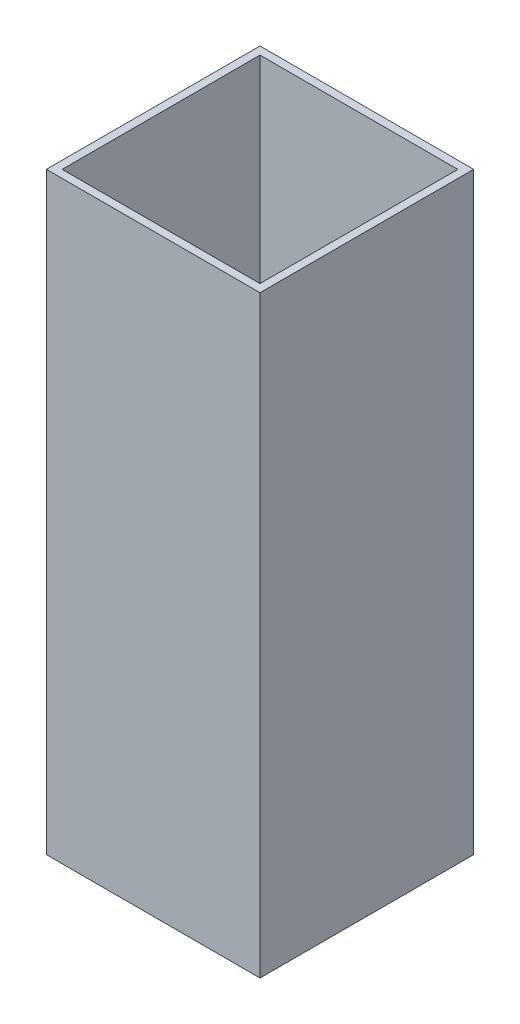
ISO-10303-21;
HEADER;
FILE_DESCRIPTION(('STEP AP214'),'2;1');
FILE_NAME('part.step','',(''),(''),'','','');
FILE_SCHEMA(('AUTOMOTIVE_DESIGN { 1 0 10303 214 1 1 1 1 }'));
ENDSEC;
DATA;
#1=APPLICATION_CONTEXT('core data for automotive mechanical design processes');
#2=APPLICATION_PROTOCOL_DEFINITION('international standard','automotive_design',2000,#1);
#3=PRODUCT_CONTEXT('',#1,'mechanical');
#4=PRODUCT('Part','Part','',(#3));
#5=PRODUCT_RELATED_PRODUCT_CATEGORY('part','',(#4));
#6=PRODUCT_DEFINITION_FORMATION('','',#4);
#7=PRODUCT_DEFINITION_CONTEXT('part definition',#1,'design');
#8=PRODUCT_DEFINITION('design','',#6,#7);
#9=PRODUCT_DEFINITION_SHAPE('','',#8);
#10=(LENGTH_UNIT() NAMED_UNIT(*) SI_UNIT(.MILLI.,.METRE.));
#11=(NAMED_UNIT(*) PLANE_ANGLE_UNIT() SI_UNIT($,.RADIAN.));
#12=(NAMED_UNIT(*) SI_UNIT($,.STERADIAN.) SOLID_ANGLE_UNIT());
#13=UNCERTAINTY_MEASURE_WITH_UNIT(LENGTH_MEASURE(1.E-05),#10,'distance_accuracy_value','');
#14=(GEOMETRIC_REPRESENTATION_CONTEXT(3) GLOBAL_UNCERTAINTY_ASSIGNED_CONTEXT((#13)) GLOBAL_UNIT_ASSIGNED_CONTEXT((#10,
#11,#12)) REPRESENTATION_CONTEXT('',''));
#15=CARTESIAN_POINT('',(0.,0.,0.));
#16=DIRECTION('',(0.,0.,1.));
#17=DIRECTION('',(1.,0.,0.));
#18=AXIS2_PLACEMENT_3D('',#15,#16,#17);
#19=CARTESIAN_POINT('',(-67.5,375.,67.5));
#20=DIRECTION('',(1.,0.,0.));
#21=DIRECTION('',(0.,0.,-1.));
#22=AXIS2_PLACEMENT_3D('',#19,#20,#21);
#23=PLANE('',#22);
#24=DIRECTION('',(0.,0.,1.));
#25=VECTOR('',#24,1.);
#26=CARTESIAN_POINT('',(-67.5,0.,67.5));
#27=LINE('',#26,#25);
#28=CARTESIAN_POINT('',(-67.5,0.,-67.5));
#29=VERTEX_POINT('',#28);
#30=CARTESIAN_POINT('',(-67.5,0.,67.5));
#31=VERTEX_POINT('',#30);
#32=EDGE_CURVE('E149',#29,#31,#27,.T.);
#33=ORIENTED_EDGE('',*,*,#32,.T.);
#34=DIRECTION('',(0.,-1.,0.));
#35=VECTOR('',#34,1.);
#36=CARTESIAN_POINT('',(-67.5,375.,67.5));
#37=LINE('',#36,#35);
#38=CARTESIAN_POINT('',(-67.5,375.,67.5));
#39=VERTEX_POINT('',#38);
#40=EDGE_CURVE('E11',#39,#31,#37,.T.);
#41=ORIENTED_EDGE('',*,*,#40,.F.);
#42=DIRECTION('',(0.,0.,1.));
#43=VECTOR('',#42,1.);
#44=CARTESIAN_POINT('',(-67.5,375.,67.5));
#45=LINE('',#44,#43);
#46=CARTESIAN_POINT('',(-67.5,375.,-67.5));
#47=VERTEX_POINT('',#46);
#48=EDGE_CURVE('E142',#47,#39,#45,.T.);
#49=ORIENTED_EDGE('',*,*,#48,.F.);
#50=DIRECTION('',(0.,-1.,0.));
#51=VECTOR('',#50,1.);
#52=CARTESIAN_POINT('',(-67.5,375.,-67.5));
#53=LINE('',#52,#51);
#54=EDGE_CURVE('E148',#47,#29,#53,.T.);
#55=ORIENTED_EDGE('',*,*,#54,.T.);
#56=EDGE_LOOP('',(#33,#41,#49,#55));
#57=FACE_BOUND('',#56,.T.);
#58=ADVANCED_FACE('F35',(#57),#23,.F.);
#59=CARTESIAN_POINT('',(67.5,375.,67.5));
#60=DIRECTION('',(0.,0.,-1.));
#61=DIRECTION('',(-1.,0.,0.));
#62=AXIS2_PLACEMENT_3D('',#59,#60,#61);
#63=PLANE('',#62);
#64=DIRECTION('',(1.,0.,0.));
#65=VECTOR('',#64,1.);
#66=CARTESIAN_POINT('',(67.5,0.,67.5));
#67=LINE('',#66,#65);
#68=CARTESIAN_POINT('',(67.5,0.,67.5));
#69=VERTEX_POINT('',#68);
#70=EDGE_CURVE('E152',#31,#69,#67,.T.);
#71=ORIENTED_EDGE('',*,*,#70,.T.);
#72=DIRECTION('',(0.,-1.,0.));
#73=VECTOR('',#72,1.);
#74=CARTESIAN_POINT('',(67.5,375.,67.5));
#75=LINE('',#74,#73);
#76=CARTESIAN_POINT('',(67.5,375.,67.5));
#77=VERTEX_POINT('',#76);
#78=EDGE_CURVE('E42',#77,#69,#75,.T.);
#79=ORIENTED_EDGE('',*,*,#78,.F.);
#80=DIRECTION('',(1.,0.,0.));
#81=VECTOR('',#80,1.);
#82=CARTESIAN_POINT('',(67.5,375.,67.5));
#83=LINE('',#82,#81);
#84=EDGE_CURVE('E86',#39,#77,#83,.T.);
#85=ORIENTED_EDGE('',*,*,#84,.F.);
#86=ORIENTED_EDGE('',*,*,#40,.T.);
#87=EDGE_LOOP('',(#71,#79,#85,#86));
#88=FACE_BOUND('',#87,.T.);
#89=ADVANCED_FACE('F181',(#88),#63,.F.);
#90=CARTESIAN_POINT('',(67.5,375.,67.5));
#91=DIRECTION('',(-1.,0.,0.));
#92=DIRECTION('',(0.,0.,1.));
#93=AXIS2_PLACEMENT_3D('',#90,#91,#92);
#94=PLANE('',#93);
#95=DIRECTION('',(0.,0.,-1.));
#96=VECTOR('',#95,1.);
#97=CARTESIAN_POINT('',(67.5,0.,67.5));
#98=LINE('',#97,#96);
#99=CARTESIAN_POINT('',(67.5,0.,-67.5));
#100=VERTEX_POINT('',#99);
#101=EDGE_CURVE('E154',#69,#100,#98,.T.);
#102=ORIENTED_EDGE('',*,*,#101,.T.);
#103=DIRECTION('',(0.,-1.,0.));
#104=VECTOR('',#103,1.);
#105=CARTESIAN_POINT('',(67.5,375.,-67.5));
#106=LINE('',#105,#104);
#107=CARTESIAN_POINT('',(67.5,375.,-67.5));
#108=VERTEX_POINT('',#107);
#109=EDGE_CURVE('E158',#108,#100,#106,.T.);
#110=ORIENTED_EDGE('',*,*,#109,.F.);
#111=DIRECTION('',(0.,0.,-1.));
#112=VECTOR('',#111,1.);
#113=CARTESIAN_POINT('',(67.5,375.,67.5));
#114=LINE('',#113,#112);
#115=EDGE_CURVE('E145',#77,#108,#114,.T.);
#116=ORIENTED_EDGE('',*,*,#115,.F.);
#117=ORIENTED_EDGE('',*,*,#78,.T.);
#118=EDGE_LOOP('',(#102,#110,#116,#117));
#119=FACE_BOUND('',#118,.T.);
#120=ADVANCED_FACE('F163',(#119),#94,.F.);
#121=CARTESIAN_POINT('',(67.5,375.,-67.5));
#122=DIRECTION('',(0.,0.,1.));
#123=DIRECTION('',(1.,0.,0.));
#124=AXIS2_PLACEMENT_3D('',#121,#122,#123);
#125=PLANE('',#124);
#126=DIRECTION('',(-1.,0.,0.));
#127=VECTOR('',#126,1.);
#128=CARTESIAN_POINT('',(67.5,0.,-67.5));
#129=LINE('',#128,#127);
#130=EDGE_CURVE('E79',#100,#29,#129,.T.);
#131=ORIENTED_EDGE('',*,*,#130,.T.);
#132=ORIENTED_EDGE('',*,*,#54,.F.);
#133=DIRECTION('',(-1.,0.,0.));
#134=VECTOR('',#133,1.);
#135=CARTESIAN_POINT('',(67.5,375.,-67.5));
#136=LINE('',#135,#134);
#137=EDGE_CURVE('E58',#108,#47,#136,.T.);
#138=ORIENTED_EDGE('',*,*,#137,.F.);
#139=ORIENTED_EDGE('',*,*,#109,.T.);
#140=EDGE_LOOP('',(#131,#132,#138,#139));
#141=FACE_BOUND('',#140,.T.);
#142=ADVANCED_FACE('F171',(#141),#125,.F.);
#143=CARTESIAN_POINT('',(0.,375.,0.));
#144=DIRECTION('',(0.,1.,0.));
#145=DIRECTION('',(0.,0.,1.));
#146=AXIS2_PLACEMENT_3D('',#143,#144,#145);
#147=PLANE('',#146);
#148=DIRECTION('',(0.,0.,1.));
#149=VECTOR('',#148,1.);
#150=CARTESIAN_POINT('',(-62.5,375.,67.5));
#151=LINE('',#150,#149);
#152=CARTESIAN_POINT('',(-62.5,375.,-62.5));
#153=VERTEX_POINT('',#152);
#154=CARTESIAN_POINT('',(-62.5,375.,62.5));
#155=VERTEX_POINT('',#154);
#156=EDGE_CURVE('E131',#153,#155,#151,.T.);
#157=ORIENTED_EDGE('',*,*,#156,.F.);
#158=DIRECTION('',(-1.,0.,0.));
#159=VECTOR('',#158,1.);
#160=CARTESIAN_POINT('',(67.5,375.,-62.5));
#161=LINE('',#160,#159);
#162=CARTESIAN_POINT('',(62.5,375.,-62.5));
#163=VERTEX_POINT('',#162);
#164=EDGE_CURVE('E140',#163,#153,#161,.T.);
#165=ORIENTED_EDGE('',*,*,#164,.F.);
#166=DIRECTION('',(0.,0.,-1.));
#167=VECTOR('',#166,1.);
#168=CARTESIAN_POINT('',(62.5,375.,67.5));
#169=LINE('',#168,#167);
#170=CARTESIAN_POINT('',(62.5,375.,62.5));
#171=VERTEX_POINT('',#170);
#172=EDGE_CURVE('E138',#171,#163,#169,.T.);
#173=ORIENTED_EDGE('',*,*,#172,.F.);
#174=DIRECTION('',(1.,0.,0.));
#175=VECTOR('',#174,1.);
#176=CARTESIAN_POINT('',(67.5,375.,62.5));
#177=LINE('',#176,#175);
#178=EDGE_CURVE('E123',#155,#171,#177,.T.);
#179=ORIENTED_EDGE('',*,*,#178,.F.);
#180=EDGE_LOOP('',(#157,#165,#173,#179));
#181=FACE_BOUND('',#180,.T.);
#182=ORIENTED_EDGE('',*,*,#48,.T.);
#183=ORIENTED_EDGE('',*,*,#84,.T.);
#184=ORIENTED_EDGE('',*,*,#115,.T.);
#185=ORIENTED_EDGE('',*,*,#137,.T.);
#186=EDGE_LOOP('',(#182,#183,#184,#185));
#187=FACE_BOUND('',#186,.T.);
#188=ADVANCED_FACE('F173',(#181,#187),#147,.T.);
#189=CARTESIAN_POINT('',(0.,0.,0.));
#190=DIRECTION('',(0.,1.,0.));
#191=DIRECTION('',(0.,0.,1.));
#192=AXIS2_PLACEMENT_3D('',#189,#190,#191);
#193=PLANE('',#192);
#194=ORIENTED_EDGE('',*,*,#32,.F.);
#195=ORIENTED_EDGE('',*,*,#130,.F.);
#196=ORIENTED_EDGE('',*,*,#101,.F.);
#197=ORIENTED_EDGE('',*,*,#70,.F.);
#198=EDGE_LOOP('',(#194,#195,#196,#197));
#199=FACE_BOUND('',#198,.T.);
#200=ADVANCED_FACE('F167',(#199),#193,.F.);
#201=CARTESIAN_POINT('',(-62.5,375.,67.5));
#202=DIRECTION('',(1.,0.,0.));
#203=DIRECTION('',(0.,0.,-1.));
#204=AXIS2_PLACEMENT_3D('',#201,#202,#203);
#205=PLANE('',#204);
#206=DIRECTION('',(0.,0.,1.));
#207=VECTOR('',#206,1.);
#208=CARTESIAN_POINT('',(-62.5,5.,67.5));
#209=LINE('',#208,#207);
#210=CARTESIAN_POINT('',(-62.5,5.,-62.5));
#211=VERTEX_POINT('',#210);
#212=CARTESIAN_POINT('',(-62.5,5.,62.5));
#213=VERTEX_POINT('',#212);
#214=EDGE_CURVE('E114',#211,#213,#209,.T.);
#215=ORIENTED_EDGE('',*,*,#214,.F.);
#216=DIRECTION('',(0.,-1.,0.));
#217=VECTOR('',#216,1.);
#218=CARTESIAN_POINT('',(-62.5,375.,-62.5));
#219=LINE('',#218,#217);
#220=EDGE_CURVE('E134',#153,#211,#219,.T.);
#221=ORIENTED_EDGE('',*,*,#220,.F.);
#222=ORIENTED_EDGE('',*,*,#156,.T.);
#223=DIRECTION('',(0.,-1.,0.));
#224=VECTOR('',#223,1.);
#225=CARTESIAN_POINT('',(-62.5,375.,62.5));
#226=LINE('',#225,#224);
#227=EDGE_CURVE('E126',#155,#213,#226,.T.);
#228=ORIENTED_EDGE('',*,*,#227,.T.);
#229=EDGE_LOOP('',(#215,#221,#222,#228));
#230=FACE_BOUND('',#229,.T.);
#231=ADVANCED_FACE('F213',(#230),#205,.T.);
#232=CARTESIAN_POINT('',(67.5,375.,62.5));
#233=DIRECTION('',(0.,0.,-1.));
#234=DIRECTION('',(-1.,0.,0.));
#235=AXIS2_PLACEMENT_3D('',#232,#233,#234);
#236=PLANE('',#235);
#237=DIRECTION('',(1.,0.,0.));
#238=VECTOR('',#237,1.);
#239=CARTESIAN_POINT('',(67.5,5.,62.5));
#240=LINE('',#239,#238);
#241=CARTESIAN_POINT('',(62.5,5.,62.5));
#242=VERTEX_POINT('',#241);
#243=EDGE_CURVE('E108',#213,#242,#240,.T.);
#244=ORIENTED_EDGE('',*,*,#243,.F.);
#245=ORIENTED_EDGE('',*,*,#227,.F.);
#246=ORIENTED_EDGE('',*,*,#178,.T.);
#247=DIRECTION('',(0.,-1.,0.));
#248=VECTOR('',#247,1.);
#249=CARTESIAN_POINT('',(62.5,375.,62.5));
#250=LINE('',#249,#248);
#251=EDGE_CURVE('E120',#171,#242,#250,.T.);
#252=ORIENTED_EDGE('',*,*,#251,.T.);
#253=EDGE_LOOP('',(#244,#245,#246,#252));
#254=FACE_BOUND('',#253,.T.);
#255=ADVANCED_FACE('F121',(#254),#236,.T.);
#256=CARTESIAN_POINT('',(62.5,375.,67.5));
#257=DIRECTION('',(-1.,0.,0.));
#258=DIRECTION('',(0.,0.,1.));
#259=AXIS2_PLACEMENT_3D('',#256,#257,#258);
#260=PLANE('',#259);
#261=DIRECTION('',(0.,0.,-1.));
#262=VECTOR('',#261,1.);
#263=CARTESIAN_POINT('',(62.5,5.,67.5));
#264=LINE('',#263,#262);
#265=CARTESIAN_POINT('',(62.5,5.,-62.5));
#266=VERTEX_POINT('',#265);
#267=EDGE_CURVE('E112',#242,#266,#264,.T.);
#268=ORIENTED_EDGE('',*,*,#267,.F.);
#269=ORIENTED_EDGE('',*,*,#251,.F.);
#270=ORIENTED_EDGE('',*,*,#172,.T.);
#271=DIRECTION('',(0.,-1.,0.));
#272=VECTOR('',#271,1.);
#273=CARTESIAN_POINT('',(62.5,375.,-62.5));
#274=LINE('',#273,#272);
#275=EDGE_CURVE('E49',#163,#266,#274,.T.);
#276=ORIENTED_EDGE('',*,*,#275,.T.);
#277=EDGE_LOOP('',(#268,#269,#270,#276));
#278=FACE_BOUND('',#277,.T.);
#279=ADVANCED_FACE('F128',(#278),#260,.T.);
#280=CARTESIAN_POINT('',(67.5,375.,-62.5));
#281=DIRECTION('',(0.,0.,1.));
#282=DIRECTION('',(1.,0.,0.));
#283=AXIS2_PLACEMENT_3D('',#280,#281,#282);
#284=PLANE('',#283);
#285=DIRECTION('',(-1.,0.,0.));
#286=VECTOR('',#285,1.);
#287=CARTESIAN_POINT('',(67.5,5.,-62.5));
#288=LINE('',#287,#286);
#289=EDGE_CURVE('E129',#266,#211,#288,.T.);
#290=ORIENTED_EDGE('',*,*,#289,.F.);
#291=ORIENTED_EDGE('',*,*,#275,.F.);
#292=ORIENTED_EDGE('',*,*,#164,.T.);
#293=ORIENTED_EDGE('',*,*,#220,.T.);
#294=EDGE_LOOP('',(#290,#291,#292,#293));
#295=FACE_BOUND('',#294,.T.);
#296=ADVANCED_FACE('F238',(#295),#284,.T.);
#297=CARTESIAN_POINT('',(0.,5.,0.));
#298=DIRECTION('',(0.,1.,0.));
#299=DIRECTION('',(0.,0.,1.));
#300=AXIS2_PLACEMENT_3D('',#297,#298,#299);
#301=PLANE('',#300);
#302=ORIENTED_EDGE('',*,*,#214,.T.);
#303=ORIENTED_EDGE('',*,*,#243,.T.);
#304=ORIENTED_EDGE('',*,*,#267,.T.);
#305=ORIENTED_EDGE('',*,*,#289,.T.);
#306=EDGE_LOOP('',(#302,#303,#304,#305));
#307=FACE_BOUND('',#306,.T.);
#308=ADVANCED_FACE('F110',(#307),#301,.T.);
#309=CLOSED_SHELL('',(#58,#89,#120,#142,#188,#200,#231,#255,#279,#296,#308));
#310=MANIFOLD_SOLID_BREP('B2',#309);
#311=ADVANCED_BREP_SHAPE_REPRESENTATION('',(#18,#310),#14);
#312=SHAPE_DEFINITION_REPRESENTATION(#9,#311);
ENDSEC;
END-ISO-10303-21;
